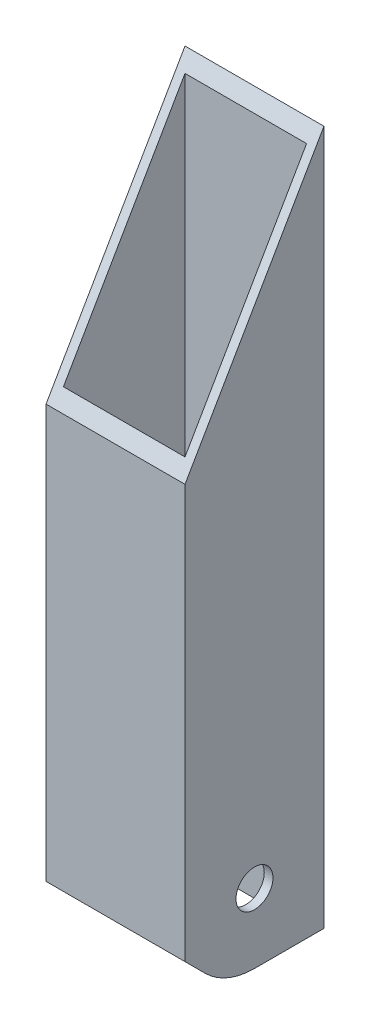
ISO-10303-21;
HEADER;
FILE_DESCRIPTION(('STEP AP214'),'2;1');
FILE_NAME('part.step','',(''),(''),'','','');
FILE_SCHEMA(('AUTOMOTIVE_DESIGN { 1 0 10303 214 1 1 1 1 }'));
ENDSEC;
DATA;
#1=APPLICATION_CONTEXT('core data for automotive mechanical design processes');
#2=APPLICATION_PROTOCOL_DEFINITION('international standard','automotive_design',2000,#1);
#3=PRODUCT_CONTEXT('',#1,'mechanical');
#4=PRODUCT('Part','Part','',(#3));
#5=PRODUCT_RELATED_PRODUCT_CATEGORY('part','',(#4));
#6=PRODUCT_DEFINITION_FORMATION('','',#4);
#7=PRODUCT_DEFINITION_CONTEXT('part definition',#1,'design');
#8=PRODUCT_DEFINITION('design','',#6,#7);
#9=PRODUCT_DEFINITION_SHAPE('','',#8);
#10=(LENGTH_UNIT() NAMED_UNIT(*) SI_UNIT(.MILLI.,.METRE.));
#11=(NAMED_UNIT(*) PLANE_ANGLE_UNIT() SI_UNIT($,.RADIAN.));
#12=(NAMED_UNIT(*) SI_UNIT($,.STERADIAN.) SOLID_ANGLE_UNIT());
#13=UNCERTAINTY_MEASURE_WITH_UNIT(LENGTH_MEASURE(1.E-05),#10,'distance_accuracy_value','');
#14=(GEOMETRIC_REPRESENTATION_CONTEXT(3) GLOBAL_UNCERTAINTY_ASSIGNED_CONTEXT((#13)) GLOBAL_UNIT_ASSIGNED_CONTEXT((#10,
#11,#12)) REPRESENTATION_CONTEXT('',''));
#15=CARTESIAN_POINT('',(0.,0.,0.));
#16=DIRECTION('',(0.,0.,1.));
#17=DIRECTION('',(1.,0.,0.));
#18=AXIS2_PLACEMENT_3D('',#15,#16,#17);
#19=CARTESIAN_POINT('',(12.7,0.,-12.7));
#20=DIRECTION('',(0.,-1.,0.));
#21=DIRECTION('',(0.,0.,-1.));
#22=AXIS2_PLACEMENT_3D('',#19,#20,#21);
#23=PLANE('',#22);
#24=DIRECTION('',(0.,0.,-1.));
#25=VECTOR('',#24,1.);
#26=CARTESIAN_POINT('',(12.7,0.,12.7));
#27=LINE('',#26,#25);
#28=CARTESIAN_POINT('',(12.7,0.,0.));
#29=VERTEX_POINT('',#28);
#30=CARTESIAN_POINT('',(12.7,0.,-12.7));
#31=VERTEX_POINT('',#30);
#32=EDGE_CURVE('E194',#29,#31,#27,.T.);
#33=ORIENTED_EDGE('',*,*,#32,.F.);
#34=DIRECTION('',(1.,0.,0.));
#35=VECTOR('',#34,1.);
#36=CARTESIAN_POINT('',(-12.7,0.,0.));
#37=LINE('',#36,#35);
#38=CARTESIAN_POINT('',(11.1125,0.,0.));
#39=VERTEX_POINT('',#38);
#40=EDGE_CURVE('E125',#39,#29,#37,.T.);
#41=ORIENTED_EDGE('',*,*,#40,.F.);
#42=DIRECTION('',(0.,0.,-1.));
#43=VECTOR('',#42,1.);
#44=CARTESIAN_POINT('',(11.1125,0.,11.1125));
#45=LINE('',#44,#43);
#46=CARTESIAN_POINT('',(11.1125,0.,-11.1125));
#47=VERTEX_POINT('',#46);
#48=EDGE_CURVE('E178',#39,#47,#45,.T.);
#49=ORIENTED_EDGE('',*,*,#48,.T.);
#50=DIRECTION('',(-1.,0.,0.));
#51=VECTOR('',#50,1.);
#52=CARTESIAN_POINT('',(-11.1125,0.,-11.1125));
#53=LINE('',#52,#51);
#54=CARTESIAN_POINT('',(-11.1125,0.,-11.1125));
#55=VERTEX_POINT('',#54);
#56=EDGE_CURVE('E180',#47,#55,#53,.T.);
#57=ORIENTED_EDGE('',*,*,#56,.T.);
#58=DIRECTION('',(0.,0.,1.));
#59=VECTOR('',#58,1.);
#60=CARTESIAN_POINT('',(-11.1125,0.,11.1125));
#61=LINE('',#60,#59);
#62=CARTESIAN_POINT('',(-11.1125,0.,0.));
#63=VERTEX_POINT('',#62);
#64=EDGE_CURVE('E175',#55,#63,#61,.T.);
#65=ORIENTED_EDGE('',*,*,#64,.T.);
#66=CARTESIAN_POINT('',(-12.7,0.,0.));
#67=VERTEX_POINT('',#66);
#68=EDGE_CURVE('E248',#67,#63,#37,.T.);
#69=ORIENTED_EDGE('',*,*,#68,.F.);
#70=DIRECTION('',(0.,0.,1.));
#71=VECTOR('',#70,1.);
#72=CARTESIAN_POINT('',(-12.7,0.,12.7));
#73=LINE('',#72,#71);
#74=CARTESIAN_POINT('',(-12.7,0.,-12.7));
#75=VERTEX_POINT('',#74);
#76=EDGE_CURVE('E135',#75,#67,#73,.T.);
#77=ORIENTED_EDGE('',*,*,#76,.F.);
#78=DIRECTION('',(-1.,0.,0.));
#79=VECTOR('',#78,1.);
#80=CARTESIAN_POINT('',(-12.7,0.,-12.7));
#81=LINE('',#80,#79);
#82=EDGE_CURVE('E199',#31,#75,#81,.T.);
#83=ORIENTED_EDGE('',*,*,#82,.F.);
#84=EDGE_LOOP('',(#33,#41,#49,#57,#65,#69,#77,#83));
#85=FACE_BOUND('',#84,.T.);
#86=ADVANCED_FACE('F32',(#85),#23,.T.);
#87=CARTESIAN_POINT('',(-12.7,0.,5.26051224213831));
#88=DIRECTION('',(0.,0.707106781186548,-0.707106781186548));
#89=DIRECTION('',(0.,0.707106781186548,0.707106781186548));
#90=AXIS2_PLACEMENT_3D('',#87,#88,#89);
#91=PLANE('',#90);
#92=DIRECTION('',(1.,0.,0.));
#93=VECTOR('',#92,1.);
#94=CARTESIAN_POINT('',(-12.7,3.71974387893084,8.98025612106916));
#95=LINE('',#94,#93);
#96=CARTESIAN_POINT('',(12.7,3.71974387893084,8.98025612106915));
#97=VERTEX_POINT('',#96);
#98=CARTESIAN_POINT('',(11.1125,3.71974387893084,8.98025612106916));
#99=VERTEX_POINT('',#98);
#100=EDGE_CURVE('E11',#97,#99,#95,.F.);
#101=ORIENTED_EDGE('',*,*,#100,.F.);
#102=DIRECTION('',(0.,0.707106781186548,0.707106781186548));
#103=VECTOR('',#102,1.);
#104=CARTESIAN_POINT('',(12.7,0.,5.26051224213831));
#105=LINE('',#104,#103);
#106=CARTESIAN_POINT('',(12.7,7.43948775786169,12.7));
#107=VERTEX_POINT('',#106);
#108=EDGE_CURVE('E141',#97,#107,#105,.T.);
#109=ORIENTED_EDGE('',*,*,#108,.T.);
#110=DIRECTION('',(1.,0.,0.));
#111=VECTOR('',#110,1.);
#112=CARTESIAN_POINT('',(-12.7,7.43948775786169,12.7));
#113=LINE('',#112,#111);
#114=CARTESIAN_POINT('',(-12.7,7.43948775786169,12.7));
#115=VERTEX_POINT('',#114);
#116=EDGE_CURVE('E139',#115,#107,#113,.T.);
#117=ORIENTED_EDGE('',*,*,#116,.F.);
#118=DIRECTION('',(0.,0.707106781186548,0.707106781186548));
#119=VECTOR('',#118,1.);
#120=CARTESIAN_POINT('',(-12.7,0.,5.26051224213831));
#121=LINE('',#120,#119);
#122=CARTESIAN_POINT('',(-12.7,3.71974387893084,8.98025612106916));
#123=VERTEX_POINT('',#122);
#124=EDGE_CURVE('E131',#123,#115,#121,.T.);
#125=ORIENTED_EDGE('',*,*,#124,.F.);
#126=DIRECTION('',(1.,0.,0.));
#127=VECTOR('',#126,1.);
#128=CARTESIAN_POINT('',(-12.7,3.71974387893084,8.98025612106916));
#129=LINE('',#128,#127);
#130=CARTESIAN_POINT('',(-11.1125,3.71974387893086,8.98025612106915));
#131=VERTEX_POINT('',#130);
#132=EDGE_CURVE('E117',#123,#131,#129,.T.);
#133=ORIENTED_EDGE('',*,*,#132,.T.);
#134=DIRECTION('',(0.,0.707106781186548,0.707106781186548));
#135=VECTOR('',#134,1.);
#136=CARTESIAN_POINT('',(-11.1125,66.4259938789309,71.6865061210692));
#137=LINE('',#136,#135);
#138=CARTESIAN_POINT('',(-11.1125,5.85198775786171,11.1125));
#139=VERTEX_POINT('',#138);
#140=EDGE_CURVE('E150',#131,#139,#137,.T.);
#141=ORIENTED_EDGE('',*,*,#140,.T.);
#142=DIRECTION('',(1.,0.,0.));
#143=VECTOR('',#142,1.);
#144=CARTESIAN_POINT('',(-11.1125,5.85198775786171,11.1125));
#145=LINE('',#144,#143);
#146=CARTESIAN_POINT('',(11.1125,5.85198775786172,11.1125));
#147=VERTEX_POINT('',#146);
#148=EDGE_CURVE('E143',#139,#147,#145,.T.);
#149=ORIENTED_EDGE('',*,*,#148,.T.);
#150=DIRECTION('',(0.,-0.707106781186548,-0.707106781186548));
#151=VECTOR('',#150,1.);
#152=CARTESIAN_POINT('',(11.1125,66.4259938789309,71.6865061210692));
#153=LINE('',#152,#151);
#154=EDGE_CURVE('E40',#147,#99,#153,.T.);
#155=ORIENTED_EDGE('',*,*,#154,.T.);
#156=EDGE_LOOP('',(#101,#109,#117,#125,#133,#141,#149,#155));
#157=FACE_BOUND('',#156,.T.);
#158=ADVANCED_FACE('F137',(#157),#91,.F.);
#159=CARTESIAN_POINT('',(12.7,127.,12.7));
#160=DIRECTION('',(-1.,0.,0.));
#161=DIRECTION('',(0.,0.,1.));
#162=AXIS2_PLACEMENT_3D('',#159,#160,#161);
#163=PLANE('',#162);
#164=CARTESIAN_POINT('',(12.7,12.7,0.));
#165=DIRECTION('',(1.,0.,0.));
#166=DIRECTION('',(0.,0.,-1.));
#167=AXIS2_PLACEMENT_3D('',#164,#165,#166);
#168=CIRCLE('',#167,3.37819999999999);
#169=CARTESIAN_POINT('',(12.7,12.7,-3.37819999999999));
#170=VERTEX_POINT('',#169);
#171=EDGE_CURVE('E152',#170,#170,#168,.T.);
#172=ORIENTED_EDGE('',*,*,#171,.F.);
#173=EDGE_LOOP('',(#172));
#174=FACE_BOUND('',#173,.T.);
#175=ORIENTED_EDGE('',*,*,#108,.F.);
#176=CARTESIAN_POINT('',(12.7,12.7,0.));
#177=DIRECTION('',(-1.,0.,0.));
#178=DIRECTION('',(0.,0.,1.));
#179=AXIS2_PLACEMENT_3D('',#176,#177,#178);
#180=CIRCLE('',#179,12.7);
#181=EDGE_CURVE('E46',#29,#97,#180,.T.);
#182=ORIENTED_EDGE('',*,*,#181,.F.);
#183=ORIENTED_EDGE('',*,*,#32,.T.);
#184=DIRECTION('',(0.,-1.,0.));
#185=VECTOR('',#184,1.);
#186=CARTESIAN_POINT('',(12.7,127.,-12.7));
#187=LINE('',#186,#185);
#188=CARTESIAN_POINT('',(12.7,127.,-12.7));
#189=VERTEX_POINT('',#188);
#190=EDGE_CURVE('E208',#189,#31,#187,.T.);
#191=ORIENTED_EDGE('',*,*,#190,.F.);
#192=DIRECTION('',(0.,0.866025403784436,-0.500000000000004));
#193=VECTOR('',#192,1.);
#194=CARTESIAN_POINT('',(12.7,83.005909487751,12.7));
#195=LINE('',#194,#193);
#196=CARTESIAN_POINT('',(12.7,83.005909487751,12.7));
#197=VERTEX_POINT('',#196);
#198=EDGE_CURVE('E162',#197,#189,#195,.T.);
#199=ORIENTED_EDGE('',*,*,#198,.F.);
#200=DIRECTION('',(0.,-1.,0.));
#201=VECTOR('',#200,1.);
#202=CARTESIAN_POINT('',(12.7,127.,12.7));
#203=LINE('',#202,#201);
#204=EDGE_CURVE('E197',#197,#107,#203,.T.);
#205=ORIENTED_EDGE('',*,*,#204,.T.);
#206=EDGE_LOOP('',(#175,#182,#183,#191,#199,#205));
#207=FACE_BOUND('',#206,.T.);
#208=ADVANCED_FACE('F34',(#174,#207),#163,.F.);
#209=CARTESIAN_POINT('',(-12.7,127.,-12.7));
#210=DIRECTION('',(0.,0.,1.));
#211=DIRECTION('',(1.,0.,0.));
#212=AXIS2_PLACEMENT_3D('',#209,#210,#211);
#213=PLANE('',#212);
#214=ORIENTED_EDGE('',*,*,#82,.T.);
#215=DIRECTION('',(0.,-1.,0.));
#216=VECTOR('',#215,1.);
#217=CARTESIAN_POINT('',(-12.7,127.,-12.7));
#218=LINE('',#217,#216);
#219=CARTESIAN_POINT('',(-12.7,127.,-12.7));
#220=VERTEX_POINT('',#219);
#221=EDGE_CURVE('E206',#220,#75,#218,.T.);
#222=ORIENTED_EDGE('',*,*,#221,.F.);
#223=DIRECTION('',(-1.,0.,0.));
#224=VECTOR('',#223,1.);
#225=CARTESIAN_POINT('',(-12.7,127.,-12.7));
#226=LINE('',#225,#224);
#227=EDGE_CURVE('E195',#189,#220,#226,.T.);
#228=ORIENTED_EDGE('',*,*,#227,.F.);
#229=ORIENTED_EDGE('',*,*,#190,.T.);
#230=EDGE_LOOP('',(#214,#222,#228,#229));
#231=FACE_BOUND('',#230,.T.);
#232=ADVANCED_FACE('F272',(#231),#213,.F.);
#233=CARTESIAN_POINT('',(-12.7,127.,12.7));
#234=DIRECTION('',(1.,0.,0.));
#235=DIRECTION('',(0.,0.,-1.));
#236=AXIS2_PLACEMENT_3D('',#233,#234,#235);
#237=PLANE('',#236);
#238=CARTESIAN_POINT('',(-12.7,12.7,0.));
#239=DIRECTION('',(1.,0.,0.));
#240=DIRECTION('',(0.,0.,-1.));
#241=AXIS2_PLACEMENT_3D('',#238,#239,#240);
#242=CIRCLE('',#241,3.37819999999999);
#243=CARTESIAN_POINT('',(-12.7,12.7,-3.37819999999999));
#244=VERTEX_POINT('',#243);
#245=EDGE_CURVE('E155',#244,#244,#242,.T.);
#246=ORIENTED_EDGE('',*,*,#245,.T.);
#247=EDGE_LOOP('',(#246));
#248=FACE_BOUND('',#247,.T.);
#249=ORIENTED_EDGE('',*,*,#76,.T.);
#250=CARTESIAN_POINT('',(-12.7,12.7,0.));
#251=DIRECTION('',(-1.,0.,0.));
#252=DIRECTION('',(0.,0.,1.));
#253=AXIS2_PLACEMENT_3D('',#250,#251,#252);
#254=CIRCLE('',#253,12.7);
#255=EDGE_CURVE('E120',#67,#123,#254,.T.);
#256=ORIENTED_EDGE('',*,*,#255,.T.);
#257=ORIENTED_EDGE('',*,*,#124,.T.);
#258=DIRECTION('',(0.,-1.,0.));
#259=VECTOR('',#258,1.);
#260=CARTESIAN_POINT('',(-12.7,127.,12.7));
#261=LINE('',#260,#259);
#262=CARTESIAN_POINT('',(-12.7,83.005909487751,12.7));
#263=VERTEX_POINT('',#262);
#264=EDGE_CURVE('E204',#263,#115,#261,.T.);
#265=ORIENTED_EDGE('',*,*,#264,.F.);
#266=DIRECTION('',(0.,0.866025403784436,-0.500000000000004));
#267=VECTOR('',#266,1.);
#268=CARTESIAN_POINT('',(-12.7,83.005909487751,12.7));
#269=LINE('',#268,#267);
#270=EDGE_CURVE('E163',#263,#220,#269,.T.);
#271=ORIENTED_EDGE('',*,*,#270,.T.);
#272=ORIENTED_EDGE('',*,*,#221,.T.);
#273=EDGE_LOOP('',(#249,#256,#257,#265,#271,#272));
#274=FACE_BOUND('',#273,.T.);
#275=ADVANCED_FACE('F129',(#248,#274),#237,.F.);
#276=CARTESIAN_POINT('',(-12.7,127.,12.7));
#277=DIRECTION('',(0.,0.,-1.));
#278=DIRECTION('',(-1.,0.,0.));
#279=AXIS2_PLACEMENT_3D('',#276,#277,#278);
#280=PLANE('',#279);
#281=ORIENTED_EDGE('',*,*,#264,.T.);
#282=ORIENTED_EDGE('',*,*,#116,.T.);
#283=ORIENTED_EDGE('',*,*,#204,.F.);
#284=DIRECTION('',(1.,0.,0.));
#285=VECTOR('',#284,1.);
#286=CARTESIAN_POINT('',(-12.7,83.005909487751,12.7));
#287=LINE('',#286,#285);
#288=EDGE_CURVE('E166',#263,#197,#287,.T.);
#289=ORIENTED_EDGE('',*,*,#288,.F.);
#290=EDGE_LOOP('',(#281,#282,#283,#289));
#291=FACE_BOUND('',#290,.T.);
#292=ADVANCED_FACE('F267',(#291),#280,.F.);
#293=CARTESIAN_POINT('',(-11.1125,127.,11.1125));
#294=DIRECTION('',(1.,0.,0.));
#295=DIRECTION('',(0.,0.,-1.));
#296=AXIS2_PLACEMENT_3D('',#293,#294,#295);
#297=PLANE('',#296);
#298=CARTESIAN_POINT('',(-11.1125,12.7,0.));
#299=DIRECTION('',(1.,0.,0.));
#300=DIRECTION('',(0.,0.,-1.));
#301=AXIS2_PLACEMENT_3D('',#298,#299,#300);
#302=CIRCLE('',#301,12.7);
#303=EDGE_CURVE('E54',#63,#131,#302,.F.);
#304=ORIENTED_EDGE('',*,*,#303,.F.);
#305=ORIENTED_EDGE('',*,*,#64,.F.);
#306=DIRECTION('',(0.,-1.,0.));
#307=VECTOR('',#306,1.);
#308=CARTESIAN_POINT('',(-11.1125,127.,-11.1125));
#309=LINE('',#308,#307);
#310=CARTESIAN_POINT('',(-11.1125,124.250369342984,-11.1125));
#311=VERTEX_POINT('',#310);
#312=EDGE_CURVE('E183',#311,#55,#309,.T.);
#313=ORIENTED_EDGE('',*,*,#312,.F.);
#314=DIRECTION('',(0.,0.866025403784437,-0.500000000000004));
#315=VECTOR('',#314,1.);
#316=CARTESIAN_POINT('',(-11.1125,116.688885036191,-6.74687499999991));
#317=LINE('',#316,#315);
#318=CARTESIAN_POINT('',(-11.1125,85.7555401447665,11.1125));
#319=VERTEX_POINT('',#318);
#320=EDGE_CURVE('E173',#319,#311,#317,.T.);
#321=ORIENTED_EDGE('',*,*,#320,.F.);
#322=DIRECTION('',(0.,-1.,0.));
#323=VECTOR('',#322,1.);
#324=CARTESIAN_POINT('',(-11.1125,127.,11.1125));
#325=LINE('',#324,#323);
#326=EDGE_CURVE('E191',#319,#139,#325,.T.);
#327=ORIENTED_EDGE('',*,*,#326,.T.);
#328=ORIENTED_EDGE('',*,*,#140,.F.);
#329=EDGE_LOOP('',(#304,#305,#313,#321,#327,#328));
#330=FACE_BOUND('',#329,.T.);
#331=CARTESIAN_POINT('',(-11.1125,12.7,0.));
#332=DIRECTION('',(1.,0.,0.));
#333=DIRECTION('',(0.,0.,-1.));
#334=AXIS2_PLACEMENT_3D('',#331,#332,#333);
#335=CIRCLE('',#334,3.37819999999999);
#336=CARTESIAN_POINT('',(-11.1125,12.7,-3.37819999999999));
#337=VERTEX_POINT('',#336);
#338=EDGE_CURVE('E159',#337,#337,#335,.T.);
#339=ORIENTED_EDGE('',*,*,#338,.F.);
#340=EDGE_LOOP('',(#339));
#341=FACE_BOUND('',#340,.T.);
#342=ADVANCED_FACE('F237',(#330,#341),#297,.T.);
#343=CARTESIAN_POINT('',(-11.1125,127.,11.1125));
#344=DIRECTION('',(0.,0.,-1.));
#345=DIRECTION('',(-1.,0.,0.));
#346=AXIS2_PLACEMENT_3D('',#343,#344,#345);
#347=PLANE('',#346);
#348=ORIENTED_EDGE('',*,*,#148,.F.);
#349=ORIENTED_EDGE('',*,*,#326,.F.);
#350=DIRECTION('',(-1.,0.,0.));
#351=VECTOR('',#350,1.);
#352=CARTESIAN_POINT('',(-11.1125,85.7555401447665,11.1125));
#353=LINE('',#352,#351);
#354=CARTESIAN_POINT('',(11.1125,85.7555401447665,11.1125));
#355=VERTEX_POINT('',#354);
#356=EDGE_CURVE('E171',#355,#319,#353,.T.);
#357=ORIENTED_EDGE('',*,*,#356,.F.);
#358=DIRECTION('',(0.,-1.,0.));
#359=VECTOR('',#358,1.);
#360=CARTESIAN_POINT('',(11.1125,127.,11.1125));
#361=LINE('',#360,#359);
#362=EDGE_CURVE('E188',#355,#147,#361,.T.);
#363=ORIENTED_EDGE('',*,*,#362,.T.);
#364=EDGE_LOOP('',(#348,#349,#357,#363));
#365=FACE_BOUND('',#364,.T.);
#366=ADVANCED_FACE('F228',(#365),#347,.T.);
#367=CARTESIAN_POINT('',(11.1125,127.,11.1125));
#368=DIRECTION('',(-1.,0.,0.));
#369=DIRECTION('',(0.,0.,1.));
#370=AXIS2_PLACEMENT_3D('',#367,#368,#369);
#371=PLANE('',#370);
#372=CARTESIAN_POINT('',(11.1125,12.7,0.));
#373=DIRECTION('',(-1.,0.,0.));
#374=DIRECTION('',(0.,0.,1.));
#375=AXIS2_PLACEMENT_3D('',#372,#373,#374);
#376=CIRCLE('',#375,12.7);
#377=EDGE_CURVE('E225',#99,#39,#376,.F.);
#378=ORIENTED_EDGE('',*,*,#377,.F.);
#379=ORIENTED_EDGE('',*,*,#154,.F.);
#380=ORIENTED_EDGE('',*,*,#362,.F.);
#381=DIRECTION('',(0.,-0.866025403784437,0.500000000000004));
#382=VECTOR('',#381,1.);
#383=CARTESIAN_POINT('',(11.1125,116.688885036191,-6.74687499999991));
#384=LINE('',#383,#382);
#385=CARTESIAN_POINT('',(11.1125,124.250369342984,-11.1125));
#386=VERTEX_POINT('',#385);
#387=EDGE_CURVE('E169',#386,#355,#384,.T.);
#388=ORIENTED_EDGE('',*,*,#387,.F.);
#389=DIRECTION('',(0.,-1.,0.));
#390=VECTOR('',#389,1.);
#391=CARTESIAN_POINT('',(11.1125,127.,-11.1125));
#392=LINE('',#391,#390);
#393=EDGE_CURVE('E185',#386,#47,#392,.T.);
#394=ORIENTED_EDGE('',*,*,#393,.T.);
#395=ORIENTED_EDGE('',*,*,#48,.F.);
#396=EDGE_LOOP('',(#378,#379,#380,#388,#394,#395));
#397=FACE_BOUND('',#396,.T.);
#398=CARTESIAN_POINT('',(11.1125,12.7,0.));
#399=DIRECTION('',(-1.,0.,0.));
#400=DIRECTION('',(0.,0.,1.));
#401=AXIS2_PLACEMENT_3D('',#398,#399,#400);
#402=CIRCLE('',#401,3.37819999999999);
#403=CARTESIAN_POINT('',(11.1125,12.7,3.37819999999999));
#404=VERTEX_POINT('',#403);
#405=EDGE_CURVE('E158',#404,#404,#402,.T.);
#406=ORIENTED_EDGE('',*,*,#405,.F.);
#407=EDGE_LOOP('',(#406));
#408=FACE_BOUND('',#407,.T.);
#409=ADVANCED_FACE('F221',(#397,#408),#371,.T.);
#410=CARTESIAN_POINT('',(-11.1125,127.,-11.1125));
#411=DIRECTION('',(0.,0.,1.));
#412=DIRECTION('',(1.,0.,0.));
#413=AXIS2_PLACEMENT_3D('',#410,#411,#412);
#414=PLANE('',#413);
#415=DIRECTION('',(1.,0.,0.));
#416=VECTOR('',#415,1.);
#417=CARTESIAN_POINT('',(-11.1125,124.250369342984,-11.1125));
#418=LINE('',#417,#416);
#419=EDGE_CURVE('E211',#311,#386,#418,.T.);
#420=ORIENTED_EDGE('',*,*,#419,.F.);
#421=ORIENTED_EDGE('',*,*,#312,.T.);
#422=ORIENTED_EDGE('',*,*,#56,.F.);
#423=ORIENTED_EDGE('',*,*,#393,.F.);
#424=EDGE_LOOP('',(#420,#421,#422,#423));
#425=FACE_BOUND('',#424,.T.);
#426=ADVANCED_FACE('F242',(#425),#414,.T.);
#427=CARTESIAN_POINT('',(-12.7,83.005909487751,12.7));
#428=DIRECTION('',(0.,-0.500000000000004,-0.866025403784436));
#429=DIRECTION('',(0.,0.866025403784437,-0.500000000000004));
#430=AXIS2_PLACEMENT_3D('',#427,#428,#429);
#431=PLANE('',#430);
#432=ORIENTED_EDGE('',*,*,#320,.T.);
#433=ORIENTED_EDGE('',*,*,#419,.T.);
#434=ORIENTED_EDGE('',*,*,#387,.T.);
#435=ORIENTED_EDGE('',*,*,#356,.T.);
#436=EDGE_LOOP('',(#432,#433,#434,#435));
#437=FACE_BOUND('',#436,.T.);
#438=ORIENTED_EDGE('',*,*,#198,.T.);
#439=ORIENTED_EDGE('',*,*,#227,.T.);
#440=ORIENTED_EDGE('',*,*,#270,.F.);
#441=ORIENTED_EDGE('',*,*,#288,.T.);
#442=EDGE_LOOP('',(#438,#439,#440,#441));
#443=FACE_BOUND('',#442,.T.);
#444=ADVANCED_FACE('F232',(#437,#443),#431,.F.);
#445=CARTESIAN_POINT('',(12.7,12.7,0.));
#446=DIRECTION('',(1.,0.,0.));
#447=DIRECTION('',(0.,0.,-1.));
#448=AXIS2_PLACEMENT_3D('',#445,#446,#447);
#449=CYLINDRICAL_SURFACE('',#448,3.37819999999999);
#450=ORIENTED_EDGE('',*,*,#405,.T.);
#451=EDGE_LOOP('',(#450));
#452=FACE_BOUND('',#451,.T.);
#453=ORIENTED_EDGE('',*,*,#171,.T.);
#454=EDGE_LOOP('',(#453));
#455=FACE_BOUND('',#454,.T.);
#456=ADVANCED_FACE('F288',(#452,#455),#449,.F.);
#457=ORIENTED_EDGE('',*,*,#338,.T.);
#458=EDGE_LOOP('',(#457));
#459=FACE_BOUND('',#458,.T.);
#460=ORIENTED_EDGE('',*,*,#245,.F.);
#461=EDGE_LOOP('',(#460));
#462=FACE_BOUND('',#461,.T.);
#463=ADVANCED_FACE('F257',(#459,#462),#449,.F.);
#464=CARTESIAN_POINT('',(-12.7,12.7,0.));
#465=DIRECTION('',(1.,0.,0.));
#466=DIRECTION('',(0.,0.,-1.));
#467=AXIS2_PLACEMENT_3D('',#464,#465,#466);
#468=CYLINDRICAL_SURFACE('',#467,12.7);
#469=ORIENTED_EDGE('',*,*,#303,.T.);
#470=ORIENTED_EDGE('',*,*,#132,.F.);
#471=ORIENTED_EDGE('',*,*,#255,.F.);
#472=ORIENTED_EDGE('',*,*,#68,.T.);
#473=EDGE_LOOP('',(#469,#470,#471,#472));
#474=FACE_BOUND('',#473,.T.);
#475=ADVANCED_FACE('F119',(#474),#468,.T.);
#476=ORIENTED_EDGE('',*,*,#377,.T.);
#477=ORIENTED_EDGE('',*,*,#40,.T.);
#478=ORIENTED_EDGE('',*,*,#181,.T.);
#479=ORIENTED_EDGE('',*,*,#100,.T.);
#480=EDGE_LOOP('',(#476,#477,#478,#479));
#481=FACE_BOUND('',#480,.T.);
#482=ADVANCED_FACE('F251',(#481),#468,.T.);
#483=CLOSED_SHELL('',(#86,#158,#208,#232,#275,#292,#342,#366,#409,#426,#444,#456,#463,#475,#482));
#484=MANIFOLD_SOLID_BREP('B2',#483);
#485=ADVANCED_BREP_SHAPE_REPRESENTATION('',(#18,#484),#14);
#486=SHAPE_DEFINITION_REPRESENTATION(#9,#485);
ENDSEC;
END-ISO-10303-21;
